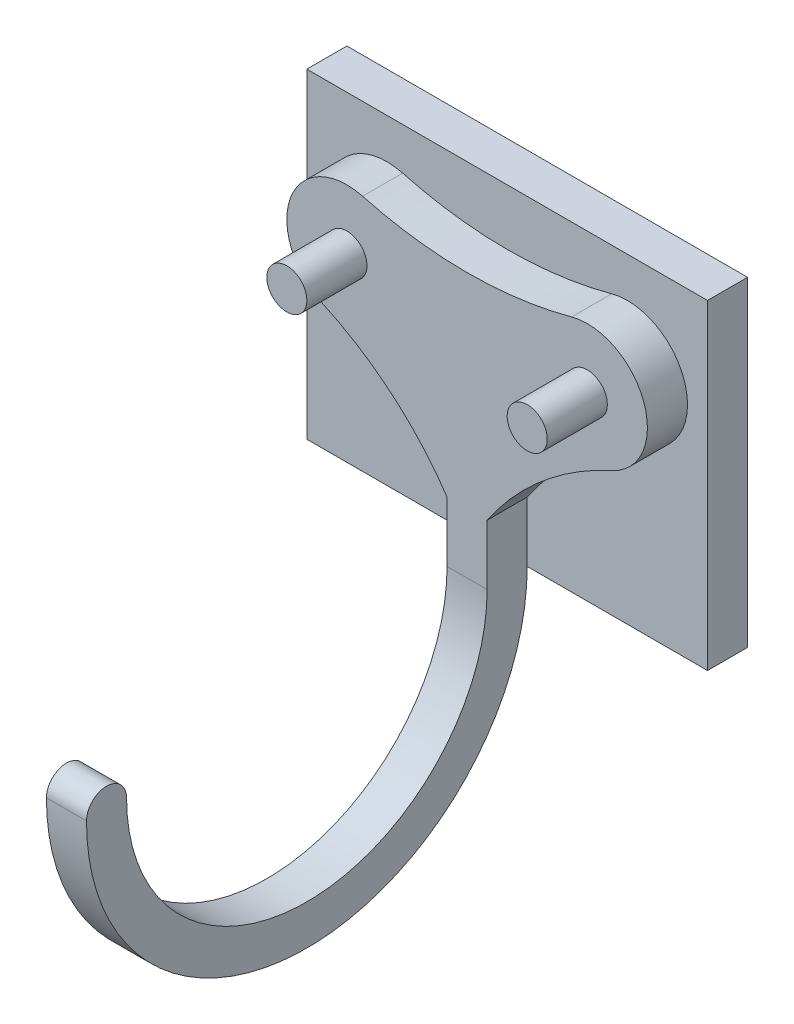
ISO-10303-21;
HEADER;
FILE_DESCRIPTION(('STEP AP214'),'2;1');
FILE_NAME('part.step','',(''),(''),'','','');
FILE_SCHEMA(('AUTOMOTIVE_DESIGN { 1 0 10303 214 1 1 1 1 }'));
ENDSEC;
DATA;
#1=APPLICATION_CONTEXT('core data for automotive mechanical design processes');
#2=APPLICATION_PROTOCOL_DEFINITION('international standard','automotive_design',2000,#1);
#3=PRODUCT_CONTEXT('',#1,'mechanical');
#4=PRODUCT('Part','Part','',(#3));
#5=PRODUCT_RELATED_PRODUCT_CATEGORY('part','',(#4));
#6=PRODUCT_DEFINITION_FORMATION('','',#4);
#7=PRODUCT_DEFINITION_CONTEXT('part definition',#1,'design');
#8=PRODUCT_DEFINITION('design','',#6,#7);
#9=PRODUCT_DEFINITION_SHAPE('','',#8);
#10=(LENGTH_UNIT() NAMED_UNIT(*) SI_UNIT(.MILLI.,.METRE.));
#11=(NAMED_UNIT(*) PLANE_ANGLE_UNIT() SI_UNIT($,.RADIAN.));
#12=(NAMED_UNIT(*) SI_UNIT($,.STERADIAN.) SOLID_ANGLE_UNIT());
#13=UNCERTAINTY_MEASURE_WITH_UNIT(LENGTH_MEASURE(1.E-05),#10,'distance_accuracy_value','');
#14=(GEOMETRIC_REPRESENTATION_CONTEXT(3) GLOBAL_UNCERTAINTY_ASSIGNED_CONTEXT((#13)) GLOBAL_UNIT_ASSIGNED_CONTEXT((#10,
#11,#12)) REPRESENTATION_CONTEXT('',''));
#15=CARTESIAN_POINT('',(0.,0.,0.));
#16=DIRECTION('',(0.,0.,1.));
#17=DIRECTION('',(1.,0.,0.));
#18=AXIS2_PLACEMENT_3D('',#15,#16,#17);
#19=CARTESIAN_POINT('',(0.,-8.,2.));
#20=DIRECTION('',(0.,1.,0.));
#21=DIRECTION('',(0.,0.,1.));
#22=AXIS2_PLACEMENT_3D('',#19,#20,#21);
#23=PLANE('',#22);
#24=DIRECTION('',(1.,0.,0.));
#25=VECTOR('',#24,1.);
#26=CARTESIAN_POINT('',(-0.999999999999999,-8.,2.));
#27=LINE('',#26,#25);
#28=CARTESIAN_POINT('',(-0.999999999999999,-8.,2.));
#29=VERTEX_POINT('',#28);
#30=CARTESIAN_POINT('',(1.,-8.,2.));
#31=VERTEX_POINT('',#30);
#32=EDGE_CURVE('E161',#29,#31,#27,.T.);
#33=ORIENTED_EDGE('',*,*,#32,.F.);
#34=DIRECTION('',(1.,0.,0.));
#35=VECTOR('',#34,1.);
#36=CARTESIAN_POINT('',(0.,-8.,2.));
#37=LINE('',#36,#35);
#38=CARTESIAN_POINT('',(-10.,-8.,2.));
#39=VERTEX_POINT('',#38);
#40=EDGE_CURVE('E277',#39,#29,#37,.T.);
#41=ORIENTED_EDGE('',*,*,#40,.F.);
#42=DIRECTION('',(0.,0.,-1.));
#43=VECTOR('',#42,1.);
#44=CARTESIAN_POINT('',(-10.,-8.,2.));
#45=LINE('',#44,#43);
#46=CARTESIAN_POINT('',(-10.,-8.,0.));
#47=VERTEX_POINT('',#46);
#48=EDGE_CURVE('E59',#39,#47,#45,.T.);
#49=ORIENTED_EDGE('',*,*,#48,.T.);
#50=DIRECTION('',(1.,0.,0.));
#51=VECTOR('',#50,1.);
#52=CARTESIAN_POINT('',(0.,-8.,0.));
#53=LINE('',#52,#51);
#54=CARTESIAN_POINT('',(10.,-8.,0.));
#55=VERTEX_POINT('',#54);
#56=EDGE_CURVE('E267',#47,#55,#53,.T.);
#57=ORIENTED_EDGE('',*,*,#56,.T.);
#58=DIRECTION('',(0.,0.,-1.));
#59=VECTOR('',#58,1.);
#60=CARTESIAN_POINT('',(10.,-8.,2.));
#61=LINE('',#60,#59);
#62=CARTESIAN_POINT('',(10.,-8.,2.));
#63=VERTEX_POINT('',#62);
#64=EDGE_CURVE('E11',#63,#55,#61,.T.);
#65=ORIENTED_EDGE('',*,*,#64,.F.);
#66=EDGE_CURVE('E85',#31,#63,#37,.T.);
#67=ORIENTED_EDGE('',*,*,#66,.F.);
#68=EDGE_LOOP('',(#33,#41,#49,#57,#65,#67));
#69=FACE_BOUND('',#68,.T.);
#70=ADVANCED_FACE('F41',(#69),#23,.F.);
#71=CARTESIAN_POINT('',(10.,0.,2.));
#72=DIRECTION('',(-1.,0.,0.));
#73=DIRECTION('',(0.,0.,1.));
#74=AXIS2_PLACEMENT_3D('',#71,#72,#73);
#75=PLANE('',#74);
#76=DIRECTION('',(0.,1.,0.));
#77=VECTOR('',#76,1.);
#78=CARTESIAN_POINT('',(10.,0.,0.));
#79=LINE('',#78,#77);
#80=CARTESIAN_POINT('',(10.,8.,0.));
#81=VERTEX_POINT('',#80);
#82=EDGE_CURVE('E262',#55,#81,#79,.T.);
#83=ORIENTED_EDGE('',*,*,#82,.T.);
#84=DIRECTION('',(0.,0.,-1.));
#85=VECTOR('',#84,1.);
#86=CARTESIAN_POINT('',(10.,8.,2.));
#87=LINE('',#86,#85);
#88=CARTESIAN_POINT('',(10.,8.,2.));
#89=VERTEX_POINT('',#88);
#90=EDGE_CURVE('E51',#89,#81,#87,.T.);
#91=ORIENTED_EDGE('',*,*,#90,.F.);
#92=DIRECTION('',(0.,1.,0.));
#93=VECTOR('',#92,1.);
#94=CARTESIAN_POINT('',(10.,0.,2.));
#95=LINE('',#94,#93);
#96=EDGE_CURVE('E276',#63,#89,#95,.T.);
#97=ORIENTED_EDGE('',*,*,#96,.F.);
#98=ORIENTED_EDGE('',*,*,#64,.T.);
#99=EDGE_LOOP('',(#83,#91,#97,#98));
#100=FACE_BOUND('',#99,.T.);
#101=ADVANCED_FACE('F43',(#100),#75,.F.);
#102=CARTESIAN_POINT('',(0.,8.,2.));
#103=DIRECTION('',(0.,1.,0.));
#104=DIRECTION('',(0.,0.,1.));
#105=AXIS2_PLACEMENT_3D('',#102,#103,#104);
#106=PLANE('',#105);
#107=DIRECTION('',(1.,0.,0.));
#108=VECTOR('',#107,1.);
#109=CARTESIAN_POINT('',(0.,8.,0.));
#110=LINE('',#109,#108);
#111=CARTESIAN_POINT('',(-10.,8.,0.));
#112=VERTEX_POINT('',#111);
#113=EDGE_CURVE('E305',#112,#81,#110,.T.);
#114=ORIENTED_EDGE('',*,*,#113,.F.);
#115=DIRECTION('',(0.,0.,-1.));
#116=VECTOR('',#115,1.);
#117=CARTESIAN_POINT('',(-10.,8.,2.));
#118=LINE('',#117,#116);
#119=CARTESIAN_POINT('',(-10.,8.,2.));
#120=VERTEX_POINT('',#119);
#121=EDGE_CURVE('E74',#120,#112,#118,.T.);
#122=ORIENTED_EDGE('',*,*,#121,.F.);
#123=DIRECTION('',(1.,0.,0.));
#124=VECTOR('',#123,1.);
#125=CARTESIAN_POINT('',(0.,8.,2.));
#126=LINE('',#125,#124);
#127=EDGE_CURVE('E280',#120,#89,#126,.T.);
#128=ORIENTED_EDGE('',*,*,#127,.T.);
#129=ORIENTED_EDGE('',*,*,#90,.T.);
#130=EDGE_LOOP('',(#114,#122,#128,#129));
#131=FACE_BOUND('',#130,.T.);
#132=ADVANCED_FACE('F318',(#131),#106,.T.);
#133=CARTESIAN_POINT('',(-10.,0.,2.));
#134=DIRECTION('',(-1.,0.,0.));
#135=DIRECTION('',(0.,0.,1.));
#136=AXIS2_PLACEMENT_3D('',#133,#134,#135);
#137=PLANE('',#136);
#138=DIRECTION('',(0.,1.,0.));
#139=VECTOR('',#138,1.);
#140=CARTESIAN_POINT('',(-10.,0.,0.));
#141=LINE('',#140,#139);
#142=EDGE_CURVE('E301',#47,#112,#141,.T.);
#143=ORIENTED_EDGE('',*,*,#142,.F.);
#144=ORIENTED_EDGE('',*,*,#48,.F.);
#145=DIRECTION('',(0.,1.,0.));
#146=VECTOR('',#145,1.);
#147=CARTESIAN_POINT('',(-10.,0.,2.));
#148=LINE('',#147,#146);
#149=EDGE_CURVE('E284',#39,#120,#148,.T.);
#150=ORIENTED_EDGE('',*,*,#149,.T.);
#151=ORIENTED_EDGE('',*,*,#121,.T.);
#152=EDGE_LOOP('',(#143,#144,#150,#151));
#153=FACE_BOUND('',#152,.T.);
#154=ADVANCED_FACE('F325',(#153),#137,.T.);
#155=CARTESIAN_POINT('',(0.,0.,2.));
#156=DIRECTION('',(0.,0.,1.));
#157=DIRECTION('',(1.,0.,0.));
#158=AXIS2_PLACEMENT_3D('',#155,#156,#157);
#159=PLANE('',#158);
#160=CARTESIAN_POINT('',(6.,3.,2.));
#161=DIRECTION('',(0.,0.,1.));
#162=DIRECTION('',(1.,0.,0.));
#163=AXIS2_PLACEMENT_3D('',#160,#161,#162);
#164=CIRCLE('',#163,3.);
#165=CARTESIAN_POINT('',(7.23852219082112,0.267590297403471,2.));
#166=VERTEX_POINT('',#165);
#167=CARTESIAN_POINT('',(5.21739130434783,5.89612217102276,2.));
#168=VERTEX_POINT('',#167);
#169=EDGE_CURVE('E263',#166,#168,#164,.T.);
#170=ORIENTED_EDGE('',*,*,#169,.F.);
#171=CARTESIAN_POINT('',(13.4311331449267,-13.3944582155792,2.));
#172=DIRECTION('',(0.,0.,1.));
#173=DIRECTION('',(1.,0.,0.));
#174=AXIS2_PLACEMENT_3D('',#171,#172,#173);
#175=CIRCLE('',#174,15.);
#176=CARTESIAN_POINT('',(1.,-5.,2.));
#177=VERTEX_POINT('',#176);
#178=EDGE_CURVE('E266',#166,#177,#175,.T.);
#179=ORIENTED_EDGE('',*,*,#178,.T.);
#180=DIRECTION('',(0.,1.,0.));
#181=VECTOR('',#180,1.);
#182=CARTESIAN_POINT('',(1.,0.,2.));
#183=LINE('',#182,#181);
#184=EDGE_CURVE('E271',#31,#177,#183,.T.);
#185=ORIENTED_EDGE('',*,*,#184,.F.);
#186=ORIENTED_EDGE('',*,*,#66,.T.);
#187=ORIENTED_EDGE('',*,*,#96,.T.);
#188=ORIENTED_EDGE('',*,*,#127,.F.);
#189=ORIENTED_EDGE('',*,*,#149,.F.);
#190=ORIENTED_EDGE('',*,*,#40,.T.);
#191=DIRECTION('',(0.,1.,0.));
#192=VECTOR('',#191,1.);
#193=CARTESIAN_POINT('',(-0.999999999999999,0.,2.));
#194=LINE('',#193,#192);
#195=CARTESIAN_POINT('',(-0.999999999999999,-5.,2.));
#196=VERTEX_POINT('',#195);
#197=EDGE_CURVE('E170',#29,#196,#194,.T.);
#198=ORIENTED_EDGE('',*,*,#197,.T.);
#199=CARTESIAN_POINT('',(-13.4311331449267,-13.3944582155792,2.));
#200=DIRECTION('',(0.,0.,1.));
#201=DIRECTION('',(1.,0.,0.));
#202=AXIS2_PLACEMENT_3D('',#199,#200,#201);
#203=CIRCLE('',#202,15.);
#204=CARTESIAN_POINT('',(-7.23852219082112,0.267590297403471,2.));
#205=VERTEX_POINT('',#204);
#206=EDGE_CURVE('E289',#205,#196,#203,.F.);
#207=ORIENTED_EDGE('',*,*,#206,.F.);
#208=CARTESIAN_POINT('',(-6.,3.,2.));
#209=DIRECTION('',(0.,0.,1.));
#210=DIRECTION('',(1.,0.,0.));
#211=AXIS2_PLACEMENT_3D('',#208,#209,#210);
#212=CIRCLE('',#211,3.);
#213=CARTESIAN_POINT('',(-5.21739130434783,5.89612217102276,2.));
#214=VERTEX_POINT('',#213);
#215=EDGE_CURVE('E292',#214,#205,#212,.T.);
#216=ORIENTED_EDGE('',*,*,#215,.F.);
#217=CARTESIAN_POINT('',(0.,25.2036033111745,2.));
#218=DIRECTION('',(0.,0.,1.));
#219=DIRECTION('',(1.,0.,0.));
#220=AXIS2_PLACEMENT_3D('',#217,#218,#219);
#221=CIRCLE('',#220,20.);
#222=EDGE_CURVE('E295',#214,#168,#221,.T.);
#223=ORIENTED_EDGE('',*,*,#222,.T.);
#224=EDGE_LOOP('',(#170,#179,#185,#186,#187,#188,#189,#190,#198,#207,#216,#223));
#225=FACE_BOUND('',#224,.T.);
#226=ADVANCED_FACE('F327',(#225),#159,.T.);
#227=CARTESIAN_POINT('',(0.,0.,0.));
#228=DIRECTION('',(0.,0.,1.));
#229=DIRECTION('',(1.,0.,0.));
#230=AXIS2_PLACEMENT_3D('',#227,#228,#229);
#231=PLANE('',#230);
#232=ORIENTED_EDGE('',*,*,#82,.F.);
#233=ORIENTED_EDGE('',*,*,#56,.F.);
#234=ORIENTED_EDGE('',*,*,#142,.T.);
#235=ORIENTED_EDGE('',*,*,#113,.T.);
#236=EDGE_LOOP('',(#232,#233,#234,#235));
#237=FACE_BOUND('',#236,.T.);
#238=ADVANCED_FACE('F324',(#237),#231,.F.);
#239=CARTESIAN_POINT('',(13.4311331449267,-13.3944582155792,4.));
#240=DIRECTION('',(0.,0.,-1.));
#241=DIRECTION('',(-1.,0.,0.));
#242=AXIS2_PLACEMENT_3D('',#239,#240,#241);
#243=CYLINDRICAL_SURFACE('',#242,15.);
#244=DIRECTION('',(0.,0.,-1.));
#245=VECTOR('',#244,1.);
#246=CARTESIAN_POINT('',(1.,-5.,4.));
#247=LINE('',#246,#245);
#248=CARTESIAN_POINT('',(1.,-5.,4.));
#249=VERTEX_POINT('',#248);
#250=EDGE_CURVE('E239',#249,#177,#247,.T.);
#251=ORIENTED_EDGE('',*,*,#250,.T.);
#252=ORIENTED_EDGE('',*,*,#178,.F.);
#253=DIRECTION('',(0.,0.,-1.));
#254=VECTOR('',#253,1.);
#255=CARTESIAN_POINT('',(7.23852219082112,0.267590297403471,4.));
#256=LINE('',#255,#254);
#257=CARTESIAN_POINT('',(7.23852219082112,0.267590297403471,4.));
#258=VERTEX_POINT('',#257);
#259=EDGE_CURVE('E258',#258,#166,#256,.T.);
#260=ORIENTED_EDGE('',*,*,#259,.F.);
#261=CARTESIAN_POINT('',(13.4311331449267,-13.3944582155792,4.));
#262=DIRECTION('',(0.,0.,1.));
#263=DIRECTION('',(1.,0.,0.));
#264=AXIS2_PLACEMENT_3D('',#261,#262,#263);
#265=CIRCLE('',#264,15.);
#266=EDGE_CURVE('E203',#258,#249,#265,.T.);
#267=ORIENTED_EDGE('',*,*,#266,.T.);
#268=EDGE_LOOP('',(#251,#252,#260,#267));
#269=FACE_BOUND('',#268,.T.);
#270=ADVANCED_FACE('F341',(#269),#243,.F.);
#271=CARTESIAN_POINT('',(6.,3.,4.));
#272=DIRECTION('',(0.,0.,-1.));
#273=DIRECTION('',(-1.,0.,0.));
#274=AXIS2_PLACEMENT_3D('',#271,#272,#273);
#275=CYLINDRICAL_SURFACE('',#274,3.);
#276=ORIENTED_EDGE('',*,*,#169,.T.);
#277=DIRECTION('',(0.,0.,-1.));
#278=VECTOR('',#277,1.);
#279=CARTESIAN_POINT('',(5.21739130434783,5.89612217102276,4.));
#280=LINE('',#279,#278);
#281=CARTESIAN_POINT('',(5.21739130434783,5.89612217102276,4.));
#282=VERTEX_POINT('',#281);
#283=EDGE_CURVE('E254',#282,#168,#280,.T.);
#284=ORIENTED_EDGE('',*,*,#283,.F.);
#285=CARTESIAN_POINT('',(6.,3.,4.));
#286=DIRECTION('',(0.,0.,1.));
#287=DIRECTION('',(1.,0.,0.));
#288=AXIS2_PLACEMENT_3D('',#285,#286,#287);
#289=CIRCLE('',#288,3.);
#290=EDGE_CURVE('E207',#258,#282,#289,.T.);
#291=ORIENTED_EDGE('',*,*,#290,.F.);
#292=ORIENTED_EDGE('',*,*,#259,.T.);
#293=EDGE_LOOP('',(#276,#284,#291,#292));
#294=FACE_BOUND('',#293,.T.);
#295=ADVANCED_FACE('F345',(#294),#275,.T.);
#296=CARTESIAN_POINT('',(0.,25.2036033111745,4.));
#297=DIRECTION('',(0.,0.,-1.));
#298=DIRECTION('',(-1.,0.,0.));
#299=AXIS2_PLACEMENT_3D('',#296,#297,#298);
#300=CYLINDRICAL_SURFACE('',#299,20.);
#301=ORIENTED_EDGE('',*,*,#283,.T.);
#302=ORIENTED_EDGE('',*,*,#222,.F.);
#303=DIRECTION('',(0.,0.,-1.));
#304=VECTOR('',#303,1.);
#305=CARTESIAN_POINT('',(-5.21739130434783,5.89612217102276,4.));
#306=LINE('',#305,#304);
#307=CARTESIAN_POINT('',(-5.21739130434783,5.89612217102276,4.));
#308=VERTEX_POINT('',#307);
#309=EDGE_CURVE('E250',#308,#214,#306,.T.);
#310=ORIENTED_EDGE('',*,*,#309,.F.);
#311=CARTESIAN_POINT('',(0.,25.2036033111745,4.));
#312=DIRECTION('',(0.,0.,1.));
#313=DIRECTION('',(1.,0.,0.));
#314=AXIS2_PLACEMENT_3D('',#311,#312,#313);
#315=CIRCLE('',#314,20.);
#316=EDGE_CURVE('E210',#308,#282,#315,.T.);
#317=ORIENTED_EDGE('',*,*,#316,.T.);
#318=EDGE_LOOP('',(#301,#302,#310,#317));
#319=FACE_BOUND('',#318,.T.);
#320=ADVANCED_FACE('F349',(#319),#300,.F.);
#321=CARTESIAN_POINT('',(-6.,3.,4.));
#322=DIRECTION('',(0.,0.,-1.));
#323=DIRECTION('',(-1.,0.,0.));
#324=AXIS2_PLACEMENT_3D('',#321,#322,#323);
#325=CYLINDRICAL_SURFACE('',#324,3.);
#326=ORIENTED_EDGE('',*,*,#215,.T.);
#327=DIRECTION('',(0.,0.,-1.));
#328=VECTOR('',#327,1.);
#329=CARTESIAN_POINT('',(-7.23852219082112,0.267590297403471,4.));
#330=LINE('',#329,#328);
#331=CARTESIAN_POINT('',(-7.23852219082112,0.267590297403471,4.));
#332=VERTEX_POINT('',#331);
#333=EDGE_CURVE('E246',#332,#205,#330,.T.);
#334=ORIENTED_EDGE('',*,*,#333,.F.);
#335=CARTESIAN_POINT('',(-6.,3.,4.));
#336=DIRECTION('',(0.,0.,1.));
#337=DIRECTION('',(1.,0.,0.));
#338=AXIS2_PLACEMENT_3D('',#335,#336,#337);
#339=CIRCLE('',#338,3.);
#340=EDGE_CURVE('E214',#308,#332,#339,.T.);
#341=ORIENTED_EDGE('',*,*,#340,.F.);
#342=ORIENTED_EDGE('',*,*,#309,.T.);
#343=EDGE_LOOP('',(#326,#334,#341,#342));
#344=FACE_BOUND('',#343,.T.);
#345=ADVANCED_FACE('F353',(#344),#325,.T.);
#346=CARTESIAN_POINT('',(-13.4311331449267,-13.3944582155792,4.));
#347=DIRECTION('',(0.,0.,-1.));
#348=DIRECTION('',(-1.,0.,0.));
#349=AXIS2_PLACEMENT_3D('',#346,#347,#348);
#350=CYLINDRICAL_SURFACE('',#349,15.);
#351=ORIENTED_EDGE('',*,*,#206,.T.);
#352=DIRECTION('',(0.,0.,-1.));
#353=VECTOR('',#352,1.);
#354=CARTESIAN_POINT('',(-0.999999999999999,-5.,4.));
#355=LINE('',#354,#353);
#356=CARTESIAN_POINT('',(-0.999999999999999,-5.,4.));
#357=VERTEX_POINT('',#356);
#358=EDGE_CURVE('E243',#357,#196,#355,.T.);
#359=ORIENTED_EDGE('',*,*,#358,.F.);
#360=CARTESIAN_POINT('',(-13.4311331449267,-13.3944582155792,4.));
#361=DIRECTION('',(0.,0.,1.));
#362=DIRECTION('',(1.,0.,0.));
#363=AXIS2_PLACEMENT_3D('',#360,#361,#362);
#364=CIRCLE('',#363,15.);
#365=EDGE_CURVE('E217',#332,#357,#364,.F.);
#366=ORIENTED_EDGE('',*,*,#365,.F.);
#367=ORIENTED_EDGE('',*,*,#333,.T.);
#368=EDGE_LOOP('',(#351,#359,#366,#367));
#369=FACE_BOUND('',#368,.T.);
#370=ADVANCED_FACE('F357',(#369),#350,.F.);
#371=CARTESIAN_POINT('',(-0.999999999999999,0.,4.));
#372=DIRECTION('',(-1.,0.,0.));
#373=DIRECTION('',(0.,0.,1.));
#374=AXIS2_PLACEMENT_3D('',#371,#372,#373);
#375=PLANE('',#374);
#376=CARTESIAN_POINT('',(-0.999999999999999,-8.,13.));
#377=DIRECTION('',(1.,0.,0.));
#378=DIRECTION('',(0.,0.,-1.));
#379=AXIS2_PLACEMENT_3D('',#376,#377,#378);
#380=CIRCLE('',#379,11.);
#381=CARTESIAN_POINT('',(-0.999999999999999,-7.99999999999992,24.));
#382=VERTEX_POINT('',#381);
#383=EDGE_CURVE('E152',#382,#29,#380,.T.);
#384=ORIENTED_EDGE('',*,*,#383,.F.);
#385=CARTESIAN_POINT('',(-0.999999999999999,-7.99999999999993,23.));
#386=DIRECTION('',(-1.,0.,0.));
#387=DIRECTION('',(0.,0.,1.));
#388=AXIS2_PLACEMENT_3D('',#385,#386,#387);
#389=CIRCLE('',#388,1.);
#390=CARTESIAN_POINT('',(-0.999999999999999,-7.99999999999994,22.));
#391=VERTEX_POINT('',#390);
#392=EDGE_CURVE('E167',#382,#391,#389,.T.);
#393=ORIENTED_EDGE('',*,*,#392,.T.);
#394=CARTESIAN_POINT('',(-0.999999999999999,-8.,13.));
#395=DIRECTION('',(1.,0.,0.));
#396=DIRECTION('',(0.,0.,-1.));
#397=AXIS2_PLACEMENT_3D('',#394,#395,#396);
#398=CIRCLE('',#397,9.);
#399=CARTESIAN_POINT('',(-0.999999999999999,-8.,4.));
#400=VERTEX_POINT('',#399);
#401=EDGE_CURVE('E192',#391,#400,#398,.T.);
#402=ORIENTED_EDGE('',*,*,#401,.T.);
#403=DIRECTION('',(0.,1.,0.));
#404=VECTOR('',#403,1.);
#405=CARTESIAN_POINT('',(-0.999999999999999,0.,4.));
#406=LINE('',#405,#404);
#407=EDGE_CURVE('E220',#400,#357,#406,.T.);
#408=ORIENTED_EDGE('',*,*,#407,.T.);
#409=ORIENTED_EDGE('',*,*,#358,.T.);
#410=ORIENTED_EDGE('',*,*,#197,.F.);
#411=EDGE_LOOP('',(#384,#393,#402,#408,#409,#410));
#412=FACE_BOUND('',#411,.T.);
#413=ADVANCED_FACE('F166',(#412),#375,.T.);
#414=CARTESIAN_POINT('',(1.,0.,4.));
#415=DIRECTION('',(-1.,0.,0.));
#416=DIRECTION('',(0.,0.,1.));
#417=AXIS2_PLACEMENT_3D('',#414,#415,#416);
#418=PLANE('',#417);
#419=CARTESIAN_POINT('',(1.,-8.,13.));
#420=DIRECTION('',(1.,0.,0.));
#421=DIRECTION('',(0.,0.,-1.));
#422=AXIS2_PLACEMENT_3D('',#419,#420,#421);
#423=CIRCLE('',#422,9.);
#424=CARTESIAN_POINT('',(1.,-7.99999999999994,22.));
#425=VERTEX_POINT('',#424);
#426=CARTESIAN_POINT('',(1.,-8.,4.));
#427=VERTEX_POINT('',#426);
#428=EDGE_CURVE('E189',#425,#427,#423,.T.);
#429=ORIENTED_EDGE('',*,*,#428,.F.);
#430=CARTESIAN_POINT('',(1.,-7.99999999999993,23.));
#431=DIRECTION('',(-1.,0.,0.));
#432=DIRECTION('',(0.,0.,1.));
#433=AXIS2_PLACEMENT_3D('',#430,#431,#432);
#434=CIRCLE('',#433,1.);
#435=CARTESIAN_POINT('',(1.,-7.99999999999992,24.));
#436=VERTEX_POINT('',#435);
#437=EDGE_CURVE('E178',#436,#425,#434,.T.);
#438=ORIENTED_EDGE('',*,*,#437,.F.);
#439=CARTESIAN_POINT('',(1.,-8.,13.));
#440=DIRECTION('',(1.,0.,0.));
#441=DIRECTION('',(0.,0.,-1.));
#442=AXIS2_PLACEMENT_3D('',#439,#440,#441);
#443=CIRCLE('',#442,11.);
#444=EDGE_CURVE('E154',#436,#31,#443,.T.);
#445=ORIENTED_EDGE('',*,*,#444,.T.);
#446=ORIENTED_EDGE('',*,*,#184,.T.);
#447=ORIENTED_EDGE('',*,*,#250,.F.);
#448=DIRECTION('',(0.,1.,0.));
#449=VECTOR('',#448,1.);
#450=CARTESIAN_POINT('',(1.,0.,4.));
#451=LINE('',#450,#449);
#452=EDGE_CURVE('E228',#427,#249,#451,.T.);
#453=ORIENTED_EDGE('',*,*,#452,.F.);
#454=EDGE_LOOP('',(#429,#438,#445,#446,#447,#453));
#455=FACE_BOUND('',#454,.T.);
#456=ADVANCED_FACE('F364',(#455),#418,.F.);
#457=CARTESIAN_POINT('',(0.,0.,4.));
#458=DIRECTION('',(0.,0.,1.));
#459=DIRECTION('',(1.,0.,0.));
#460=AXIS2_PLACEMENT_3D('',#457,#458,#459);
#461=PLANE('',#460);
#462=ORIENTED_EDGE('',*,*,#266,.F.);
#463=ORIENTED_EDGE('',*,*,#290,.T.);
#464=ORIENTED_EDGE('',*,*,#316,.F.);
#465=ORIENTED_EDGE('',*,*,#340,.T.);
#466=ORIENTED_EDGE('',*,*,#365,.T.);
#467=ORIENTED_EDGE('',*,*,#407,.F.);
#468=DIRECTION('',(1.,0.,0.));
#469=VECTOR('',#468,1.);
#470=CARTESIAN_POINT('',(0.,-8.,4.));
#471=LINE('',#470,#469);
#472=EDGE_CURVE('E224',#400,#427,#471,.T.);
#473=ORIENTED_EDGE('',*,*,#472,.T.);
#474=ORIENTED_EDGE('',*,*,#452,.T.);
#475=EDGE_LOOP('',(#462,#463,#464,#465,#466,#467,#473,#474));
#476=FACE_BOUND('',#475,.T.);
#477=CARTESIAN_POINT('',(-6.,3.,4.));
#478=DIRECTION('',(0.,0.,1.));
#479=DIRECTION('',(1.,0.,0.));
#480=AXIS2_PLACEMENT_3D('',#477,#478,#479);
#481=CIRCLE('',#480,1.);
#482=CARTESIAN_POINT('',(-5.,3.,4.));
#483=VERTEX_POINT('',#482);
#484=EDGE_CURVE('E231',#483,#483,#481,.T.);
#485=ORIENTED_EDGE('',*,*,#484,.F.);
#486=EDGE_LOOP('',(#485));
#487=FACE_BOUND('',#486,.T.);
#488=CARTESIAN_POINT('',(6.,3.,4.));
#489=DIRECTION('',(0.,0.,1.));
#490=DIRECTION('',(1.,0.,0.));
#491=AXIS2_PLACEMENT_3D('',#488,#489,#490);
#492=CIRCLE('',#491,1.);
#493=CARTESIAN_POINT('',(7.,3.,4.));
#494=VERTEX_POINT('',#493);
#495=EDGE_CURVE('E235',#494,#494,#492,.T.);
#496=ORIENTED_EDGE('',*,*,#495,.F.);
#497=EDGE_LOOP('',(#496));
#498=FACE_BOUND('',#497,.T.);
#499=ADVANCED_FACE('F367',(#476,#487,#498),#461,.T.);
#500=CARTESIAN_POINT('',(0.,0.,7.));
#501=DIRECTION('',(0.,0.,1.));
#502=DIRECTION('',(1.,0.,0.));
#503=AXIS2_PLACEMENT_3D('',#500,#501,#502);
#504=PLANE('',#503);
#505=CARTESIAN_POINT('',(-6.,3.,7.));
#506=DIRECTION('',(0.,0.,1.));
#507=DIRECTION('',(1.,0.,0.));
#508=AXIS2_PLACEMENT_3D('',#505,#506,#507);
#509=CIRCLE('',#508,1.);
#510=CARTESIAN_POINT('',(-5.,3.,7.));
#511=VERTEX_POINT('',#510);
#512=EDGE_CURVE('E199',#511,#511,#509,.T.);
#513=ORIENTED_EDGE('',*,*,#512,.T.);
#514=EDGE_LOOP('',(#513));
#515=FACE_BOUND('',#514,.T.);
#516=ADVANCED_FACE('F371',(#515),#504,.T.);
#517=CARTESIAN_POINT('',(-6.,3.,7.));
#518=DIRECTION('',(0.,0.,-1.));
#519=DIRECTION('',(-1.,0.,0.));
#520=AXIS2_PLACEMENT_3D('',#517,#518,#519);
#521=CYLINDRICAL_SURFACE('',#520,1.);
#522=ORIENTED_EDGE('',*,*,#484,.T.);
#523=EDGE_LOOP('',(#522));
#524=FACE_BOUND('',#523,.T.);
#525=ORIENTED_EDGE('',*,*,#512,.F.);
#526=EDGE_LOOP('',(#525));
#527=FACE_BOUND('',#526,.T.);
#528=ADVANCED_FACE('F373',(#524,#527),#521,.T.);
#529=CARTESIAN_POINT('',(0.,0.,7.));
#530=DIRECTION('',(0.,0.,1.));
#531=DIRECTION('',(1.,0.,0.));
#532=AXIS2_PLACEMENT_3D('',#529,#530,#531);
#533=PLANE('',#532);
#534=CARTESIAN_POINT('',(6.,3.,7.));
#535=DIRECTION('',(0.,0.,1.));
#536=DIRECTION('',(1.,0.,0.));
#537=AXIS2_PLACEMENT_3D('',#534,#535,#536);
#538=CIRCLE('',#537,1.);
#539=CARTESIAN_POINT('',(7.,3.,7.));
#540=VERTEX_POINT('',#539);
#541=EDGE_CURVE('E195',#540,#540,#538,.T.);
#542=ORIENTED_EDGE('',*,*,#541,.T.);
#543=EDGE_LOOP('',(#542));
#544=FACE_BOUND('',#543,.T.);
#545=ADVANCED_FACE('F376',(#544),#533,.T.);
#546=CARTESIAN_POINT('',(6.,3.,7.));
#547=DIRECTION('',(0.,0.,-1.));
#548=DIRECTION('',(-1.,0.,0.));
#549=AXIS2_PLACEMENT_3D('',#546,#547,#548);
#550=CYLINDRICAL_SURFACE('',#549,1.);
#551=ORIENTED_EDGE('',*,*,#495,.T.);
#552=EDGE_LOOP('',(#551));
#553=FACE_BOUND('',#552,.T.);
#554=ORIENTED_EDGE('',*,*,#541,.F.);
#555=EDGE_LOOP('',(#554));
#556=FACE_BOUND('',#555,.T.);
#557=ADVANCED_FACE('F381',(#553,#556),#550,.T.);
#558=CARTESIAN_POINT('',(-9.9,-8.,13.));
#559=DIRECTION('',(1.,0.,0.));
#560=DIRECTION('',(0.,0.,-1.));
#561=AXIS2_PLACEMENT_3D('',#558,#559,#560);
#562=CYLINDRICAL_SURFACE('',#561,9.);
#563=ORIENTED_EDGE('',*,*,#428,.T.);
#564=ORIENTED_EDGE('',*,*,#472,.F.);
#565=ORIENTED_EDGE('',*,*,#401,.F.);
#566=DIRECTION('',(-1.,0.,0.));
#567=VECTOR('',#566,1.);
#568=CARTESIAN_POINT('',(-0.999999999999999,-7.99999999999994,22.));
#569=LINE('',#568,#567);
#570=EDGE_CURVE('E160',#425,#391,#569,.T.);
#571=ORIENTED_EDGE('',*,*,#570,.F.);
#572=EDGE_LOOP('',(#563,#564,#565,#571));
#573=FACE_BOUND('',#572,.T.);
#574=ADVANCED_FACE('F384',(#573),#562,.F.);
#575=CARTESIAN_POINT('',(-9.9,-8.,13.));
#576=DIRECTION('',(1.,0.,0.));
#577=DIRECTION('',(0.,0.,-1.));
#578=AXIS2_PLACEMENT_3D('',#575,#576,#577);
#579=CYLINDRICAL_SURFACE('',#578,11.);
#580=DIRECTION('',(1.,0.,0.));
#581=VECTOR('',#580,1.);
#582=CARTESIAN_POINT('',(-0.999999999999999,-7.99999999999992,24.));
#583=LINE('',#582,#581);
#584=EDGE_CURVE('E148',#382,#436,#583,.T.);
#585=ORIENTED_EDGE('',*,*,#584,.F.);
#586=ORIENTED_EDGE('',*,*,#383,.T.);
#587=ORIENTED_EDGE('',*,*,#32,.T.);
#588=ORIENTED_EDGE('',*,*,#444,.F.);
#589=EDGE_LOOP('',(#585,#586,#587,#588));
#590=FACE_BOUND('',#589,.T.);
#591=ADVANCED_FACE('F150',(#590),#579,.T.);
#592=CARTESIAN_POINT('',(1.,-7.99999999999993,23.));
#593=DIRECTION('',(-1.,0.,0.));
#594=DIRECTION('',(0.,0.,1.));
#595=AXIS2_PLACEMENT_3D('',#592,#593,#594);
#596=CYLINDRICAL_SURFACE('',#595,1.);
#597=ORIENTED_EDGE('',*,*,#584,.T.);
#598=ORIENTED_EDGE('',*,*,#437,.T.);
#599=ORIENTED_EDGE('',*,*,#570,.T.);
#600=ORIENTED_EDGE('',*,*,#392,.F.);
#601=EDGE_LOOP('',(#597,#598,#599,#600));
#602=FACE_BOUND('',#601,.T.);
#603=ADVANCED_FACE('F175',(#602),#596,.T.);
#604=CLOSED_SHELL('',(#70,#101,#132,#154,#226,#238,#270,#295,#320,#345,#370,#413,#456,#499,#516,
#528,#545,#557,#574,#591,#603));
#605=MANIFOLD_SOLID_BREP('B2',#604);
#606=ADVANCED_BREP_SHAPE_REPRESENTATION('',(#18,#605),#14);
#607=SHAPE_DEFINITION_REPRESENTATION(#9,#606);
ENDSEC;
END-ISO-10303-21;
